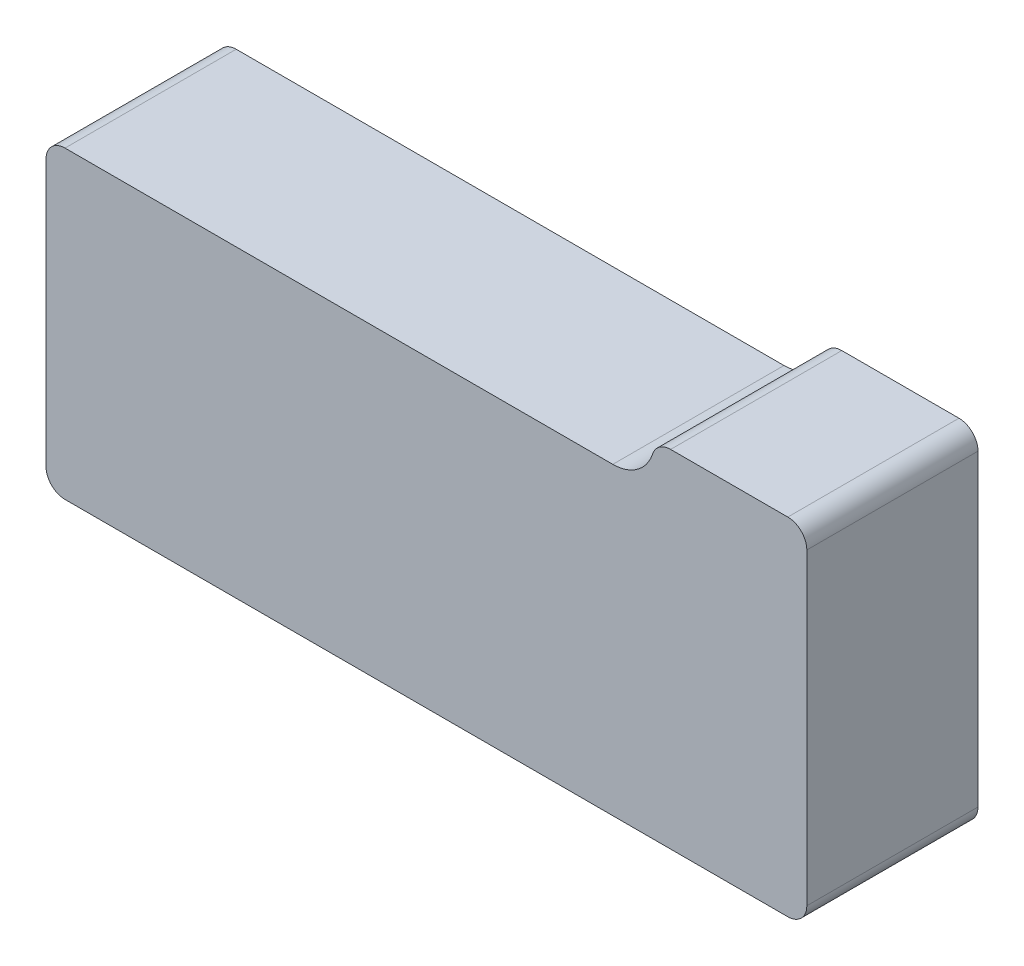
ISO-10303-21;
HEADER;
FILE_DESCRIPTION(('STEP AP214'),'2;1');
FILE_NAME('part.step','',(''),(''),'','','');
FILE_SCHEMA(('AUTOMOTIVE_DESIGN { 1 0 10303 214 1 1 1 1 }'));
ENDSEC;
DATA;
#1=APPLICATION_CONTEXT('core data for automotive mechanical design processes');
#2=APPLICATION_PROTOCOL_DEFINITION('international standard','automotive_design',2000,#1);
#3=PRODUCT_CONTEXT('',#1,'mechanical');
#4=PRODUCT('Part','Part','',(#3));
#5=PRODUCT_RELATED_PRODUCT_CATEGORY('part','',(#4));
#6=PRODUCT_DEFINITION_FORMATION('','',#4);
#7=PRODUCT_DEFINITION_CONTEXT('part definition',#1,'design');
#8=PRODUCT_DEFINITION('design','',#6,#7);
#9=PRODUCT_DEFINITION_SHAPE('','',#8);
#10=(LENGTH_UNIT() NAMED_UNIT(*) SI_UNIT(.MILLI.,.METRE.));
#11=(NAMED_UNIT(*) PLANE_ANGLE_UNIT() SI_UNIT($,.RADIAN.));
#12=(NAMED_UNIT(*) SI_UNIT($,.STERADIAN.) SOLID_ANGLE_UNIT());
#13=UNCERTAINTY_MEASURE_WITH_UNIT(LENGTH_MEASURE(1.E-05),#10,'distance_accuracy_value','');
#14=(GEOMETRIC_REPRESENTATION_CONTEXT(3) GLOBAL_UNCERTAINTY_ASSIGNED_CONTEXT((#13)) GLOBAL_UNIT_ASSIGNED_CONTEXT((#10,
#11,#12)) REPRESENTATION_CONTEXT('',''));
#15=CARTESIAN_POINT('',(0.,0.,0.));
#16=DIRECTION('',(0.,0.,1.));
#17=DIRECTION('',(1.,0.,0.));
#18=AXIS2_PLACEMENT_3D('',#15,#16,#17);
#19=CARTESIAN_POINT('',(49.,51.,45.));
#20=DIRECTION('',(0.,0.,-1.));
#21=DIRECTION('',(-1.,0.,0.));
#22=AXIS2_PLACEMENT_3D('',#19,#20,#21);
#23=CYLINDRICAL_SURFACE('',#22,11.);
#24=CARTESIAN_POINT('',(49.,51.,0.));
#25=DIRECTION('',(0.,0.,-1.));
#26=DIRECTION('',(1.,0.,0.));
#27=AXIS2_PLACEMENT_3D('',#24,#25,#26);
#28=CIRCLE('',#27,11.);
#29=CARTESIAN_POINT('',(59.4490953555798,47.5625,0.));
#30=VERTEX_POINT('',#29);
#31=CARTESIAN_POINT('',(49.,40.,0.));
#32=VERTEX_POINT('',#31);
#33=EDGE_CURVE('E151',#30,#32,#28,.T.);
#34=ORIENTED_EDGE('',*,*,#33,.T.);
#35=DIRECTION('',(0.,0.,-1.));
#36=VECTOR('',#35,1.);
#37=CARTESIAN_POINT('',(49.,40.,45.));
#38=LINE('',#37,#36);
#39=CARTESIAN_POINT('',(49.,40.,45.));
#40=VERTEX_POINT('',#39);
#41=EDGE_CURVE('E11',#40,#32,#38,.T.);
#42=ORIENTED_EDGE('',*,*,#41,.F.);
#43=CARTESIAN_POINT('',(49.,51.,45.));
#44=DIRECTION('',(0.,0.,-1.));
#45=DIRECTION('',(1.,0.,0.));
#46=AXIS2_PLACEMENT_3D('',#43,#44,#45);
#47=CIRCLE('',#46,11.);
#48=CARTESIAN_POINT('',(59.4490953555798,47.5625,45.));
#49=VERTEX_POINT('',#48);
#50=EDGE_CURVE('E175',#49,#40,#47,.T.);
#51=ORIENTED_EDGE('',*,*,#50,.F.);
#52=DIRECTION('',(0.,0.,-1.));
#53=VECTOR('',#52,1.);
#54=CARTESIAN_POINT('',(59.4490953555798,47.5625,45.));
#55=LINE('',#54,#53);
#56=EDGE_CURVE('E147',#49,#30,#55,.T.);
#57=ORIENTED_EDGE('',*,*,#56,.T.);
#58=EDGE_LOOP('',(#34,#42,#51,#57));
#59=FACE_BOUND('',#58,.T.);
#60=ADVANCED_FACE('F37',(#59),#23,.F.);
#61=CARTESIAN_POINT('',(-95.,40.,45.));
#62=DIRECTION('',(0.,-1.,0.));
#63=DIRECTION('',(1.,0.,0.));
#64=AXIS2_PLACEMENT_3D('',#61,#62,#63);
#65=PLANE('',#64);
#66=DIRECTION('',(-1.,0.,0.));
#67=VECTOR('',#66,1.);
#68=CARTESIAN_POINT('',(-95.,40.,0.));
#69=LINE('',#68,#67);
#70=CARTESIAN_POINT('',(-95.,40.,0.));
#71=VERTEX_POINT('',#70);
#72=EDGE_CURVE('E154',#32,#71,#69,.T.);
#73=ORIENTED_EDGE('',*,*,#72,.T.);
#74=DIRECTION('',(0.,0.,-1.));
#75=VECTOR('',#74,1.);
#76=CARTESIAN_POINT('',(-95.,40.,45.));
#77=LINE('',#76,#75);
#78=CARTESIAN_POINT('',(-95.,40.,45.));
#79=VERTEX_POINT('',#78);
#80=EDGE_CURVE('E45',#79,#71,#77,.T.);
#81=ORIENTED_EDGE('',*,*,#80,.F.);
#82=DIRECTION('',(-1.,0.,0.));
#83=VECTOR('',#82,1.);
#84=CARTESIAN_POINT('',(-95.,40.,45.));
#85=LINE('',#84,#83);
#86=EDGE_CURVE('E105',#40,#79,#85,.T.);
#87=ORIENTED_EDGE('',*,*,#86,.F.);
#88=ORIENTED_EDGE('',*,*,#41,.T.);
#89=EDGE_LOOP('',(#73,#81,#87,#88));
#90=FACE_BOUND('',#89,.T.);
#91=ADVANCED_FACE('F247',(#90),#65,.F.);
#92=CARTESIAN_POINT('',(-95.,35.,45.));
#93=DIRECTION('',(0.,0.,-1.));
#94=DIRECTION('',(-1.,0.,0.));
#95=AXIS2_PLACEMENT_3D('',#92,#93,#94);
#96=CYLINDRICAL_SURFACE('',#95,5.);
#97=CARTESIAN_POINT('',(-95.,35.,0.));
#98=DIRECTION('',(0.,0.,1.));
#99=DIRECTION('',(1.,0.,0.));
#100=AXIS2_PLACEMENT_3D('',#97,#98,#99);
#101=CIRCLE('',#100,5.);
#102=CARTESIAN_POINT('',(-100.,35.,0.));
#103=VERTEX_POINT('',#102);
#104=EDGE_CURVE('E157',#71,#103,#101,.T.);
#105=ORIENTED_EDGE('',*,*,#104,.T.);
#106=DIRECTION('',(0.,0.,-1.));
#107=VECTOR('',#106,1.);
#108=CARTESIAN_POINT('',(-100.,35.,45.));
#109=LINE('',#108,#107);
#110=CARTESIAN_POINT('',(-100.,35.,45.));
#111=VERTEX_POINT('',#110);
#112=EDGE_CURVE('E191',#111,#103,#109,.T.);
#113=ORIENTED_EDGE('',*,*,#112,.F.);
#114=CARTESIAN_POINT('',(-95.,35.,45.));
#115=DIRECTION('',(0.,0.,1.));
#116=DIRECTION('',(1.,0.,0.));
#117=AXIS2_PLACEMENT_3D('',#114,#115,#116);
#118=CIRCLE('',#117,5.);
#119=EDGE_CURVE('E199',#79,#111,#118,.T.);
#120=ORIENTED_EDGE('',*,*,#119,.F.);
#121=ORIENTED_EDGE('',*,*,#80,.T.);
#122=EDGE_LOOP('',(#105,#113,#120,#121));
#123=FACE_BOUND('',#122,.T.);
#124=ADVANCED_FACE('F197',(#123),#96,.T.);
#125=CARTESIAN_POINT('',(-100.,35.,45.));
#126=DIRECTION('',(1.,0.,0.));
#127=DIRECTION('',(0.,1.,0.));
#128=AXIS2_PLACEMENT_3D('',#125,#126,#127);
#129=PLANE('',#128);
#130=DIRECTION('',(0.,-1.,0.));
#131=VECTOR('',#130,1.);
#132=CARTESIAN_POINT('',(-100.,35.,0.));
#133=LINE('',#132,#131);
#134=CARTESIAN_POINT('',(-100.,-35.,0.));
#135=VERTEX_POINT('',#134);
#136=EDGE_CURVE('E159',#103,#135,#133,.T.);
#137=ORIENTED_EDGE('',*,*,#136,.T.);
#138=DIRECTION('',(0.,0.,-1.));
#139=VECTOR('',#138,1.);
#140=CARTESIAN_POINT('',(-100.,-35.,45.));
#141=LINE('',#140,#139);
#142=CARTESIAN_POINT('',(-100.,-35.,45.));
#143=VERTEX_POINT('',#142);
#144=EDGE_CURVE('E188',#143,#135,#141,.T.);
#145=ORIENTED_EDGE('',*,*,#144,.F.);
#146=DIRECTION('',(0.,-1.,0.));
#147=VECTOR('',#146,1.);
#148=CARTESIAN_POINT('',(-100.,35.,45.));
#149=LINE('',#148,#147);
#150=EDGE_CURVE('E217',#111,#143,#149,.T.);
#151=ORIENTED_EDGE('',*,*,#150,.F.);
#152=ORIENTED_EDGE('',*,*,#112,.T.);
#153=EDGE_LOOP('',(#137,#145,#151,#152));
#154=FACE_BOUND('',#153,.T.);
#155=ADVANCED_FACE('F208',(#154),#129,.F.);
#156=CARTESIAN_POINT('',(-95.,-35.,45.));
#157=DIRECTION('',(0.,0.,-1.));
#158=DIRECTION('',(-1.,0.,0.));
#159=AXIS2_PLACEMENT_3D('',#156,#157,#158);
#160=CYLINDRICAL_SURFACE('',#159,5.);
#161=CARTESIAN_POINT('',(-95.,-35.,0.));
#162=DIRECTION('',(0.,0.,1.));
#163=DIRECTION('',(1.,0.,0.));
#164=AXIS2_PLACEMENT_3D('',#161,#162,#163);
#165=CIRCLE('',#164,5.);
#166=CARTESIAN_POINT('',(-95.,-40.,0.));
#167=VERTEX_POINT('',#166);
#168=EDGE_CURVE('E162',#135,#167,#165,.T.);
#169=ORIENTED_EDGE('',*,*,#168,.T.);
#170=DIRECTION('',(0.,0.,-1.));
#171=VECTOR('',#170,1.);
#172=CARTESIAN_POINT('',(-95.,-40.,45.));
#173=LINE('',#172,#171);
#174=CARTESIAN_POINT('',(-95.,-40.,45.));
#175=VERTEX_POINT('',#174);
#176=EDGE_CURVE('E185',#175,#167,#173,.T.);
#177=ORIENTED_EDGE('',*,*,#176,.F.);
#178=CARTESIAN_POINT('',(-95.,-35.,45.));
#179=DIRECTION('',(0.,0.,1.));
#180=DIRECTION('',(1.,0.,0.));
#181=AXIS2_PLACEMENT_3D('',#178,#179,#180);
#182=CIRCLE('',#181,5.);
#183=EDGE_CURVE('E214',#143,#175,#182,.T.);
#184=ORIENTED_EDGE('',*,*,#183,.F.);
#185=ORIENTED_EDGE('',*,*,#144,.T.);
#186=EDGE_LOOP('',(#169,#177,#184,#185));
#187=FACE_BOUND('',#186,.T.);
#188=ADVANCED_FACE('F212',(#187),#160,.T.);
#189=CARTESIAN_POINT('',(-95.,-40.,45.));
#190=DIRECTION('',(0.,1.,0.));
#191=DIRECTION('',(0.,0.,1.));
#192=AXIS2_PLACEMENT_3D('',#189,#190,#191);
#193=PLANE('',#192);
#194=DIRECTION('',(1.,0.,0.));
#195=VECTOR('',#194,1.);
#196=CARTESIAN_POINT('',(-95.,-40.,0.));
#197=LINE('',#196,#195);
#198=CARTESIAN_POINT('',(95.,-40.,0.));
#199=VERTEX_POINT('',#198);
#200=EDGE_CURVE('E164',#167,#199,#197,.T.);
#201=ORIENTED_EDGE('',*,*,#200,.T.);
#202=DIRECTION('',(0.,0.,-1.));
#203=VECTOR('',#202,1.);
#204=CARTESIAN_POINT('',(95.,-40.,45.));
#205=LINE('',#204,#203);
#206=CARTESIAN_POINT('',(95.,-40.,45.));
#207=VERTEX_POINT('',#206);
#208=EDGE_CURVE('E182',#207,#199,#205,.T.);
#209=ORIENTED_EDGE('',*,*,#208,.F.);
#210=DIRECTION('',(1.,0.,0.));
#211=VECTOR('',#210,1.);
#212=CARTESIAN_POINT('',(-95.,-40.,45.));
#213=LINE('',#212,#211);
#214=EDGE_CURVE('E216',#175,#207,#213,.T.);
#215=ORIENTED_EDGE('',*,*,#214,.F.);
#216=ORIENTED_EDGE('',*,*,#176,.T.);
#217=EDGE_LOOP('',(#201,#209,#215,#216));
#218=FACE_BOUND('',#217,.T.);
#219=ADVANCED_FACE('F260',(#218),#193,.F.);
#220=CARTESIAN_POINT('',(95.,-35.,45.));
#221=DIRECTION('',(0.,0.,-1.));
#222=DIRECTION('',(-1.,0.,0.));
#223=AXIS2_PLACEMENT_3D('',#220,#221,#222);
#224=CYLINDRICAL_SURFACE('',#223,5.);
#225=CARTESIAN_POINT('',(95.,-35.,0.));
#226=DIRECTION('',(0.,0.,1.));
#227=DIRECTION('',(1.,0.,0.));
#228=AXIS2_PLACEMENT_3D('',#225,#226,#227);
#229=CIRCLE('',#228,5.);
#230=CARTESIAN_POINT('',(100.,-35.,0.));
#231=VERTEX_POINT('',#230);
#232=EDGE_CURVE('E167',#199,#231,#229,.T.);
#233=ORIENTED_EDGE('',*,*,#232,.T.);
#234=DIRECTION('',(0.,0.,-1.));
#235=VECTOR('',#234,1.);
#236=CARTESIAN_POINT('',(100.,-35.,45.));
#237=LINE('',#236,#235);
#238=CARTESIAN_POINT('',(100.,-35.,45.));
#239=VERTEX_POINT('',#238);
#240=EDGE_CURVE('E179',#239,#231,#237,.T.);
#241=ORIENTED_EDGE('',*,*,#240,.F.);
#242=CARTESIAN_POINT('',(95.,-35.,45.));
#243=DIRECTION('',(0.,0.,1.));
#244=DIRECTION('',(1.,0.,0.));
#245=AXIS2_PLACEMENT_3D('',#242,#243,#244);
#246=CIRCLE('',#245,5.);
#247=EDGE_CURVE('E219',#207,#239,#246,.T.);
#248=ORIENTED_EDGE('',*,*,#247,.F.);
#249=ORIENTED_EDGE('',*,*,#208,.T.);
#250=EDGE_LOOP('',(#233,#241,#248,#249));
#251=FACE_BOUND('',#250,.T.);
#252=ADVANCED_FACE('F228',(#251),#224,.T.);
#253=CARTESIAN_POINT('',(100.,46.,45.));
#254=DIRECTION('',(-1.,0.,0.));
#255=DIRECTION('',(0.,-1.,0.));
#256=AXIS2_PLACEMENT_3D('',#253,#254,#255);
#257=PLANE('',#256);
#258=DIRECTION('',(0.,1.,0.));
#259=VECTOR('',#258,1.);
#260=CARTESIAN_POINT('',(100.,46.,0.));
#261=LINE('',#260,#259);
#262=CARTESIAN_POINT('',(100.,46.,0.));
#263=VERTEX_POINT('',#262);
#264=EDGE_CURVE('E169',#231,#263,#261,.T.);
#265=ORIENTED_EDGE('',*,*,#264,.T.);
#266=DIRECTION('',(0.,0.,-1.));
#267=VECTOR('',#266,1.);
#268=CARTESIAN_POINT('',(100.,46.,45.));
#269=LINE('',#268,#267);
#270=CARTESIAN_POINT('',(100.,46.,45.));
#271=VERTEX_POINT('',#270);
#272=EDGE_CURVE('E142',#271,#263,#269,.T.);
#273=ORIENTED_EDGE('',*,*,#272,.F.);
#274=DIRECTION('',(0.,1.,0.));
#275=VECTOR('',#274,1.);
#276=CARTESIAN_POINT('',(100.,46.,45.));
#277=LINE('',#276,#275);
#278=EDGE_CURVE('E133',#239,#271,#277,.T.);
#279=ORIENTED_EDGE('',*,*,#278,.F.);
#280=ORIENTED_EDGE('',*,*,#240,.T.);
#281=EDGE_LOOP('',(#265,#273,#279,#280));
#282=FACE_BOUND('',#281,.T.);
#283=ADVANCED_FACE('F232',(#282),#257,.F.);
#284=CARTESIAN_POINT('',(95.,46.,45.));
#285=DIRECTION('',(0.,0.,-1.));
#286=DIRECTION('',(-1.,0.,0.));
#287=AXIS2_PLACEMENT_3D('',#284,#285,#286);
#288=CYLINDRICAL_SURFACE('',#287,5.);
#289=CARTESIAN_POINT('',(95.,46.,0.));
#290=DIRECTION('',(0.,0.,1.));
#291=DIRECTION('',(1.,0.,0.));
#292=AXIS2_PLACEMENT_3D('',#289,#290,#291);
#293=CIRCLE('',#292,5.);
#294=CARTESIAN_POINT('',(95.,51.,0.));
#295=VERTEX_POINT('',#294);
#296=EDGE_CURVE('E141',#263,#295,#293,.T.);
#297=ORIENTED_EDGE('',*,*,#296,.T.);
#298=DIRECTION('',(0.,0.,-1.));
#299=VECTOR('',#298,1.);
#300=CARTESIAN_POINT('',(95.,51.,45.));
#301=LINE('',#300,#299);
#302=CARTESIAN_POINT('',(95.,51.,45.));
#303=VERTEX_POINT('',#302);
#304=EDGE_CURVE('E138',#303,#295,#301,.T.);
#305=ORIENTED_EDGE('',*,*,#304,.F.);
#306=CARTESIAN_POINT('',(95.,46.,45.));
#307=DIRECTION('',(0.,0.,1.));
#308=DIRECTION('',(1.,0.,0.));
#309=AXIS2_PLACEMENT_3D('',#306,#307,#308);
#310=CIRCLE('',#309,5.);
#311=EDGE_CURVE('E127',#271,#303,#310,.T.);
#312=ORIENTED_EDGE('',*,*,#311,.F.);
#313=ORIENTED_EDGE('',*,*,#272,.T.);
#314=EDGE_LOOP('',(#297,#305,#312,#313));
#315=FACE_BOUND('',#314,.T.);
#316=ADVANCED_FACE('F139',(#315),#288,.T.);
#317=CARTESIAN_POINT('',(95.,51.,45.));
#318=DIRECTION('',(0.,-1.,0.));
#319=DIRECTION('',(0.,0.,-1.));
#320=AXIS2_PLACEMENT_3D('',#317,#318,#319);
#321=PLANE('',#320);
#322=DIRECTION('',(-1.,0.,0.));
#323=VECTOR('',#322,1.);
#324=CARTESIAN_POINT('',(95.,51.,0.));
#325=LINE('',#324,#323);
#326=CARTESIAN_POINT('',(64.1986841535707,51.,0.));
#327=VERTEX_POINT('',#326);
#328=EDGE_CURVE('E91',#295,#327,#325,.T.);
#329=ORIENTED_EDGE('',*,*,#328,.T.);
#330=DIRECTION('',(0.,0.,-1.));
#331=VECTOR('',#330,1.);
#332=CARTESIAN_POINT('',(64.1986841535707,51.,45.));
#333=LINE('',#332,#331);
#334=CARTESIAN_POINT('',(64.1986841535707,51.,45.));
#335=VERTEX_POINT('',#334);
#336=EDGE_CURVE('E143',#335,#327,#333,.T.);
#337=ORIENTED_EDGE('',*,*,#336,.F.);
#338=DIRECTION('',(-1.,0.,0.));
#339=VECTOR('',#338,1.);
#340=CARTESIAN_POINT('',(95.,51.,45.));
#341=LINE('',#340,#339);
#342=EDGE_CURVE('E131',#303,#335,#341,.T.);
#343=ORIENTED_EDGE('',*,*,#342,.F.);
#344=ORIENTED_EDGE('',*,*,#304,.T.);
#345=EDGE_LOOP('',(#329,#337,#343,#344));
#346=FACE_BOUND('',#345,.T.);
#347=ADVANCED_FACE('F145',(#346),#321,.F.);
#348=CARTESIAN_POINT('',(64.1986841535707,46.,45.));
#349=DIRECTION('',(0.,0.,-1.));
#350=DIRECTION('',(-1.,0.,0.));
#351=AXIS2_PLACEMENT_3D('',#348,#349,#350);
#352=CYLINDRICAL_SURFACE('',#351,5.);
#353=CARTESIAN_POINT('',(64.1986841535707,46.,0.));
#354=DIRECTION('',(0.,0.,1.));
#355=DIRECTION('',(-1.,0.,0.));
#356=AXIS2_PLACEMENT_3D('',#353,#354,#355);
#357=CIRCLE('',#356,5.);
#358=EDGE_CURVE('E97',#327,#30,#357,.T.);
#359=ORIENTED_EDGE('',*,*,#358,.T.);
#360=ORIENTED_EDGE('',*,*,#56,.F.);
#361=CARTESIAN_POINT('',(64.1986841535707,46.,45.));
#362=DIRECTION('',(0.,0.,1.));
#363=DIRECTION('',(-1.,0.,0.));
#364=AXIS2_PLACEMENT_3D('',#361,#362,#363);
#365=CIRCLE('',#364,5.);
#366=EDGE_CURVE('E53',#335,#49,#365,.T.);
#367=ORIENTED_EDGE('',*,*,#366,.F.);
#368=ORIENTED_EDGE('',*,*,#336,.T.);
#369=EDGE_LOOP('',(#359,#360,#367,#368));
#370=FACE_BOUND('',#369,.T.);
#371=ADVANCED_FACE('F236',(#370),#352,.T.);
#372=CARTESIAN_POINT('',(49.,51.,45.));
#373=DIRECTION('',(0.,0.,1.));
#374=DIRECTION('',(1.,0.,0.));
#375=AXIS2_PLACEMENT_3D('',#372,#373,#374);
#376=PLANE('',#375);
#377=ORIENTED_EDGE('',*,*,#50,.T.);
#378=ORIENTED_EDGE('',*,*,#86,.T.);
#379=ORIENTED_EDGE('',*,*,#119,.T.);
#380=ORIENTED_EDGE('',*,*,#150,.T.);
#381=ORIENTED_EDGE('',*,*,#183,.T.);
#382=ORIENTED_EDGE('',*,*,#214,.T.);
#383=ORIENTED_EDGE('',*,*,#247,.T.);
#384=ORIENTED_EDGE('',*,*,#278,.T.);
#385=ORIENTED_EDGE('',*,*,#311,.T.);
#386=ORIENTED_EDGE('',*,*,#342,.T.);
#387=ORIENTED_EDGE('',*,*,#366,.T.);
#388=EDGE_LOOP('',(#377,#378,#379,#380,#381,#382,#383,#384,#385,#386,#387));
#389=FACE_BOUND('',#388,.T.);
#390=ADVANCED_FACE('F129',(#389),#376,.T.);
#391=CARTESIAN_POINT('',(49.,51.,0.));
#392=DIRECTION('',(0.,0.,1.));
#393=DIRECTION('',(1.,0.,0.));
#394=AXIS2_PLACEMENT_3D('',#391,#392,#393);
#395=PLANE('',#394);
#396=ORIENTED_EDGE('',*,*,#33,.F.);
#397=ORIENTED_EDGE('',*,*,#358,.F.);
#398=ORIENTED_EDGE('',*,*,#328,.F.);
#399=ORIENTED_EDGE('',*,*,#296,.F.);
#400=ORIENTED_EDGE('',*,*,#264,.F.);
#401=ORIENTED_EDGE('',*,*,#232,.F.);
#402=ORIENTED_EDGE('',*,*,#200,.F.);
#403=ORIENTED_EDGE('',*,*,#168,.F.);
#404=ORIENTED_EDGE('',*,*,#136,.F.);
#405=ORIENTED_EDGE('',*,*,#104,.F.);
#406=ORIENTED_EDGE('',*,*,#72,.F.);
#407=EDGE_LOOP('',(#396,#397,#398,#399,#400,#401,#402,#403,#404,#405,#406));
#408=FACE_BOUND('',#407,.T.);
#409=ADVANCED_FACE('F203',(#408),#395,.F.);
#410=CLOSED_SHELL('',(#60,#91,#124,#155,#188,#219,#252,#283,#316,#347,#371,#390,#409));
#411=MANIFOLD_SOLID_BREP('B2',#410);
#412=ADVANCED_BREP_SHAPE_REPRESENTATION('',(#18,#411),#14);
#413=SHAPE_DEFINITION_REPRESENTATION(#9,#412);
ENDSEC;
END-ISO-10303-21;
